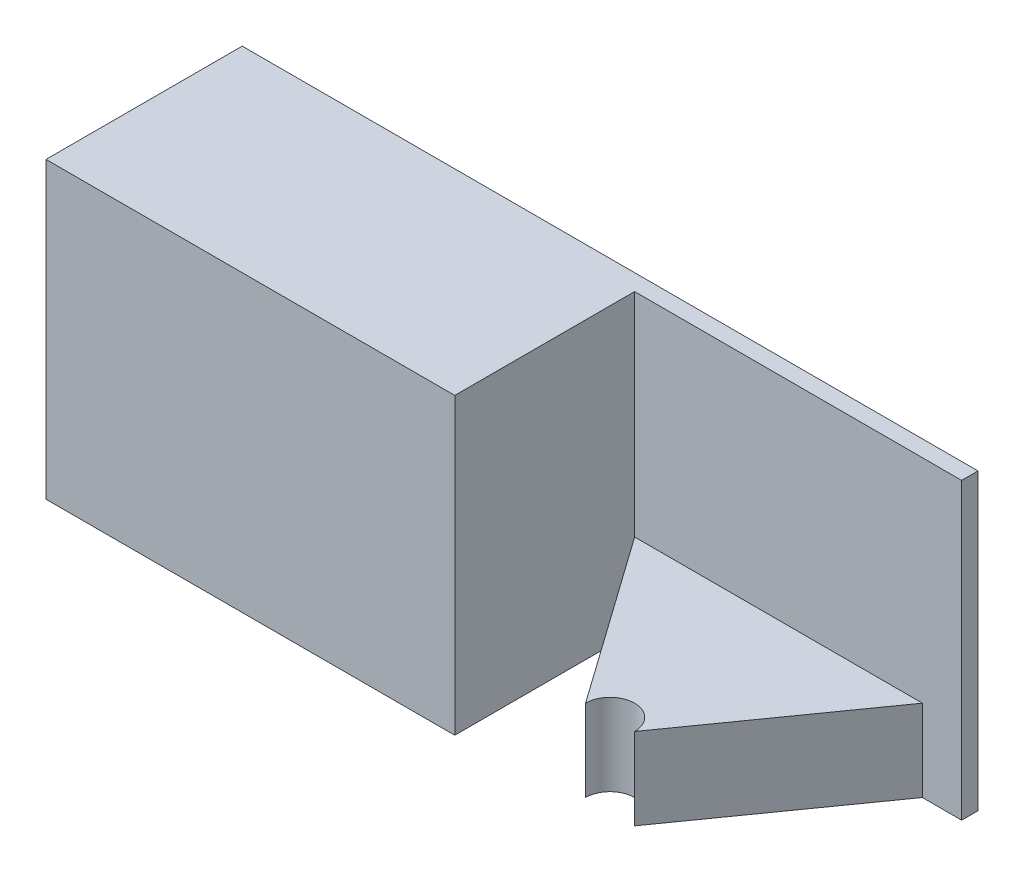
ISO-10303-21;
HEADER;
FILE_DESCRIPTION(('STEP AP214'),'2;1');
FILE_NAME('part.step','',(''),(''),'','','');
FILE_SCHEMA(('AUTOMOTIVE_DESIGN { 1 0 10303 214 1 1 1 1 }'));
ENDSEC;
DATA;
#1=APPLICATION_CONTEXT('core data for automotive mechanical design processes');
#2=APPLICATION_PROTOCOL_DEFINITION('international standard','automotive_design',2000,#1);
#3=PRODUCT_CONTEXT('',#1,'mechanical');
#4=PRODUCT('Part','Part','',(#3));
#5=PRODUCT_RELATED_PRODUCT_CATEGORY('part','',(#4));
#6=PRODUCT_DEFINITION_FORMATION('','',#4);
#7=PRODUCT_DEFINITION_CONTEXT('part definition',#1,'design');
#8=PRODUCT_DEFINITION('design','',#6,#7);
#9=PRODUCT_DEFINITION_SHAPE('','',#8);
#10=(LENGTH_UNIT() NAMED_UNIT(*) SI_UNIT(.MILLI.,.METRE.));
#11=(NAMED_UNIT(*) PLANE_ANGLE_UNIT() SI_UNIT($,.RADIAN.));
#12=(NAMED_UNIT(*) SI_UNIT($,.STERADIAN.) SOLID_ANGLE_UNIT());
#13=UNCERTAINTY_MEASURE_WITH_UNIT(LENGTH_MEASURE(1.E-05),#10,'distance_accuracy_value','');
#14=(GEOMETRIC_REPRESENTATION_CONTEXT(3) GLOBAL_UNCERTAINTY_ASSIGNED_CONTEXT((#13)) GLOBAL_UNIT_ASSIGNED_CONTEXT((#10,
#11,#12)) REPRESENTATION_CONTEXT('',''));
#15=CARTESIAN_POINT('',(0.,0.,0.));
#16=DIRECTION('',(0.,0.,1.));
#17=DIRECTION('',(1.,0.,0.));
#18=AXIS2_PLACEMENT_3D('',#15,#16,#17);
#19=CARTESIAN_POINT('',(125.,180.,60.));
#20=DIRECTION('',(-1.,0.,0.));
#21=DIRECTION('',(0.,0.,1.));
#22=AXIS2_PLACEMENT_3D('',#19,#20,#21);
#23=PLANE('',#22);
#24=DIRECTION('',(0.,-1.,0.));
#25=VECTOR('',#24,1.);
#26=CARTESIAN_POINT('',(125.,180.,-50.));
#27=LINE('',#26,#25);
#28=CARTESIAN_POINT('',(125.,180.,-50.));
#29=VERTEX_POINT('',#28);
#30=CARTESIAN_POINT('',(125.,50.,-50.));
#31=VERTEX_POINT('',#30);
#32=EDGE_CURVE('E188',#29,#31,#27,.T.);
#33=ORIENTED_EDGE('',*,*,#32,.F.);
#34=DIRECTION('',(0.,0.,-1.));
#35=VECTOR('',#34,1.);
#36=CARTESIAN_POINT('',(125.,180.,60.));
#37=LINE('',#36,#35);
#38=CARTESIAN_POINT('',(125.,180.,60.));
#39=VERTEX_POINT('',#38);
#40=EDGE_CURVE('E193',#39,#29,#37,.T.);
#41=ORIENTED_EDGE('',*,*,#40,.F.);
#42=DIRECTION('',(0.,-1.,0.));
#43=VECTOR('',#42,1.);
#44=CARTESIAN_POINT('',(125.,180.,60.));
#45=LINE('',#44,#43);
#46=CARTESIAN_POINT('',(125.,0.,60.));
#47=VERTEX_POINT('',#46);
#48=EDGE_CURVE('E199',#39,#47,#45,.T.);
#49=ORIENTED_EDGE('',*,*,#48,.T.);
#50=DIRECTION('',(0.,0.,-1.));
#51=VECTOR('',#50,1.);
#52=CARTESIAN_POINT('',(125.,0.,60.));
#53=LINE('',#52,#51);
#54=CARTESIAN_POINT('',(125.,0.,-50.));
#55=VERTEX_POINT('',#54);
#56=EDGE_CURVE('E192',#47,#55,#53,.T.);
#57=ORIENTED_EDGE('',*,*,#56,.T.);
#58=DIRECTION('',(0.,-1.,0.));
#59=VECTOR('',#58,1.);
#60=CARTESIAN_POINT('',(125.,50.,-50.));
#61=LINE('',#60,#59);
#62=EDGE_CURVE('E144',#31,#55,#61,.T.);
#63=ORIENTED_EDGE('',*,*,#62,.F.);
#64=EDGE_LOOP('',(#33,#41,#49,#57,#63));
#65=FACE_BOUND('',#64,.T.);
#66=ADVANCED_FACE('F51',(#65),#23,.F.);
#67=CARTESIAN_POINT('',(-125.,180.,-60.));
#68=DIRECTION('',(0.,0.,1.));
#69=DIRECTION('',(1.,0.,0.));
#70=AXIS2_PLACEMENT_3D('',#67,#68,#69);
#71=PLANE('',#70);
#72=DIRECTION('',(-1.,0.,0.));
#73=VECTOR('',#72,1.);
#74=CARTESIAN_POINT('',(-125.,0.,-60.));
#75=LINE('',#74,#73);
#76=CARTESIAN_POINT('',(325.,0.,-60.));
#77=VERTEX_POINT('',#76);
#78=CARTESIAN_POINT('',(-125.,0.,-60.));
#79=VERTEX_POINT('',#78);
#80=EDGE_CURVE('E202',#77,#79,#75,.T.);
#81=ORIENTED_EDGE('',*,*,#80,.T.);
#82=DIRECTION('',(0.,-1.,0.));
#83=VECTOR('',#82,1.);
#84=CARTESIAN_POINT('',(-125.,180.,-60.));
#85=LINE('',#84,#83);
#86=CARTESIAN_POINT('',(-125.,180.,-60.));
#87=VERTEX_POINT('',#86);
#88=EDGE_CURVE('E11',#87,#79,#85,.T.);
#89=ORIENTED_EDGE('',*,*,#88,.F.);
#90=DIRECTION('',(-1.,0.,0.));
#91=VECTOR('',#90,1.);
#92=CARTESIAN_POINT('',(-125.,180.,-60.));
#93=LINE('',#92,#91);
#94=CARTESIAN_POINT('',(325.,180.,-60.));
#95=VERTEX_POINT('',#94);
#96=EDGE_CURVE('E91',#95,#87,#93,.T.);
#97=ORIENTED_EDGE('',*,*,#96,.F.);
#98=DIRECTION('',(0.,-1.,0.));
#99=VECTOR('',#98,1.);
#100=CARTESIAN_POINT('',(325.,180.,-60.));
#101=LINE('',#100,#99);
#102=EDGE_CURVE('E169',#95,#77,#101,.T.);
#103=ORIENTED_EDGE('',*,*,#102,.T.);
#104=EDGE_LOOP('',(#81,#89,#97,#103));
#105=FACE_BOUND('',#104,.T.);
#106=ADVANCED_FACE('F224',(#105),#71,.F.);
#107=CARTESIAN_POINT('',(-125.,180.,60.));
#108=DIRECTION('',(1.,0.,0.));
#109=DIRECTION('',(0.,0.,-1.));
#110=AXIS2_PLACEMENT_3D('',#107,#108,#109);
#111=PLANE('',#110);
#112=DIRECTION('',(0.,0.,1.));
#113=VECTOR('',#112,1.);
#114=CARTESIAN_POINT('',(-125.,0.,60.));
#115=LINE('',#114,#113);
#116=CARTESIAN_POINT('',(-125.,0.,60.));
#117=VERTEX_POINT('',#116);
#118=EDGE_CURVE('E81',#79,#117,#115,.T.);
#119=ORIENTED_EDGE('',*,*,#118,.T.);
#120=DIRECTION('',(0.,-1.,0.));
#121=VECTOR('',#120,1.);
#122=CARTESIAN_POINT('',(-125.,180.,60.));
#123=LINE('',#122,#121);
#124=CARTESIAN_POINT('',(-125.,180.,60.));
#125=VERTEX_POINT('',#124);
#126=EDGE_CURVE('E59',#125,#117,#123,.T.);
#127=ORIENTED_EDGE('',*,*,#126,.F.);
#128=DIRECTION('',(0.,0.,1.));
#129=VECTOR('',#128,1.);
#130=CARTESIAN_POINT('',(-125.,180.,60.));
#131=LINE('',#130,#129);
#132=EDGE_CURVE('E196',#87,#125,#131,.T.);
#133=ORIENTED_EDGE('',*,*,#132,.F.);
#134=ORIENTED_EDGE('',*,*,#88,.T.);
#135=EDGE_LOOP('',(#119,#127,#133,#134));
#136=FACE_BOUND('',#135,.T.);
#137=ADVANCED_FACE('F225',(#136),#111,.F.);
#138=CARTESIAN_POINT('',(-125.,180.,60.));
#139=DIRECTION('',(0.,0.,-1.));
#140=DIRECTION('',(-1.,0.,0.));
#141=AXIS2_PLACEMENT_3D('',#138,#139,#140);
#142=PLANE('',#141);
#143=DIRECTION('',(1.,0.,0.));
#144=VECTOR('',#143,1.);
#145=CARTESIAN_POINT('',(-125.,0.,60.));
#146=LINE('',#145,#144);
#147=EDGE_CURVE('E86',#117,#47,#146,.T.);
#148=ORIENTED_EDGE('',*,*,#147,.T.);
#149=ORIENTED_EDGE('',*,*,#48,.F.);
#150=DIRECTION('',(1.,0.,0.));
#151=VECTOR('',#150,1.);
#152=CARTESIAN_POINT('',(-125.,180.,60.));
#153=LINE('',#152,#151);
#154=EDGE_CURVE('E67',#125,#39,#153,.T.);
#155=ORIENTED_EDGE('',*,*,#154,.F.);
#156=ORIENTED_EDGE('',*,*,#126,.T.);
#157=EDGE_LOOP('',(#148,#149,#155,#156));
#158=FACE_BOUND('',#157,.T.);
#159=ADVANCED_FACE('F206',(#158),#142,.F.);
#160=CARTESIAN_POINT('',(0.,180.,0.));
#161=DIRECTION('',(0.,-1.,0.));
#162=DIRECTION('',(0.,0.,-1.));
#163=AXIS2_PLACEMENT_3D('',#160,#161,#162);
#164=PLANE('',#163);
#165=ORIENTED_EDGE('',*,*,#132,.T.);
#166=ORIENTED_EDGE('',*,*,#154,.T.);
#167=ORIENTED_EDGE('',*,*,#40,.T.);
#168=DIRECTION('',(1.,0.,0.));
#169=VECTOR('',#168,1.);
#170=CARTESIAN_POINT('',(-125.,180.,-50.));
#171=LINE('',#170,#169);
#172=CARTESIAN_POINT('',(325.,180.,-50.));
#173=VERTEX_POINT('',#172);
#174=EDGE_CURVE('E177',#29,#173,#171,.T.);
#175=ORIENTED_EDGE('',*,*,#174,.T.);
#176=DIRECTION('',(0.,0.,-1.));
#177=VECTOR('',#176,1.);
#178=CARTESIAN_POINT('',(325.,180.,-50.));
#179=LINE('',#178,#177);
#180=EDGE_CURVE('E182',#173,#95,#179,.T.);
#181=ORIENTED_EDGE('',*,*,#180,.T.);
#182=ORIENTED_EDGE('',*,*,#96,.T.);
#183=EDGE_LOOP('',(#165,#166,#167,#175,#181,#182));
#184=FACE_BOUND('',#183,.T.);
#185=ADVANCED_FACE('F214',(#184),#164,.F.);
#186=CARTESIAN_POINT('',(0.,0.,0.));
#187=DIRECTION('',(0.,-1.,0.));
#188=DIRECTION('',(0.,0.,-1.));
#189=AXIS2_PLACEMENT_3D('',#186,#187,#188);
#190=PLANE('',#189);
#191=ORIENTED_EDGE('',*,*,#80,.F.);
#192=DIRECTION('',(0.,0.,-1.));
#193=VECTOR('',#192,1.);
#194=CARTESIAN_POINT('',(325.,0.,-50.));
#195=LINE('',#194,#193);
#196=CARTESIAN_POINT('',(325.,0.,-50.));
#197=VERTEX_POINT('',#196);
#198=EDGE_CURVE('E185',#197,#77,#195,.T.);
#199=ORIENTED_EDGE('',*,*,#198,.F.);
#200=DIRECTION('',(-1.,0.,0.));
#201=VECTOR('',#200,1.);
#202=CARTESIAN_POINT('',(325.,0.,-50.));
#203=LINE('',#202,#201);
#204=CARTESIAN_POINT('',(300.98,0.,-50.));
#205=VERTEX_POINT('',#204);
#206=EDGE_CURVE('E174',#197,#205,#203,.T.);
#207=ORIENTED_EDGE('',*,*,#206,.T.);
#208=DIRECTION('',(-0.578184365295858,0.,0.815906146396402));
#209=VECTOR('',#208,1.);
#210=CARTESIAN_POINT('',(227.99,0.,53.));
#211=LINE('',#210,#209);
#212=CARTESIAN_POINT('',(227.99,0.,53.));
#213=VERTEX_POINT('',#212);
#214=EDGE_CURVE('E158',#205,#213,#211,.T.);
#215=ORIENTED_EDGE('',*,*,#214,.T.);
#216=CARTESIAN_POINT('',(212.99,0.,53.));
#217=DIRECTION('',(0.,1.,0.));
#218=DIRECTION('',(0.,0.,-1.));
#219=AXIS2_PLACEMENT_3D('',#216,#217,#218);
#220=CIRCLE('',#219,15.);
#221=CARTESIAN_POINT('',(197.99,0.,53.));
#222=VERTEX_POINT('',#221);
#223=EDGE_CURVE('E165',#213,#222,#220,.T.);
#224=ORIENTED_EDGE('',*,*,#223,.T.);
#225=DIRECTION('',(-0.578184365295858,0.,-0.815906146396402));
#226=VECTOR('',#225,1.);
#227=CARTESIAN_POINT('',(197.99,0.,53.));
#228=LINE('',#227,#226);
#229=EDGE_CURVE('E139',#222,#55,#228,.T.);
#230=ORIENTED_EDGE('',*,*,#229,.T.);
#231=ORIENTED_EDGE('',*,*,#56,.F.);
#232=ORIENTED_EDGE('',*,*,#147,.F.);
#233=ORIENTED_EDGE('',*,*,#118,.F.);
#234=EDGE_LOOP('',(#191,#199,#207,#215,#224,#230,#231,#232,#233));
#235=FACE_BOUND('',#234,.T.);
#236=ADVANCED_FACE('F210',(#235),#190,.T.);
#237=CARTESIAN_POINT('',(0.,0.,-50.));
#238=DIRECTION('',(0.,0.,-1.));
#239=DIRECTION('',(-1.,0.,0.));
#240=AXIS2_PLACEMENT_3D('',#237,#238,#239);
#241=PLANE('',#240);
#242=DIRECTION('',(1.,0.,0.));
#243=VECTOR('',#242,1.);
#244=CARTESIAN_POINT('',(125.,50.,-50.));
#245=LINE('',#244,#243);
#246=CARTESIAN_POINT('',(300.98,50.,-50.));
#247=VERTEX_POINT('',#246);
#248=EDGE_CURVE('E154',#31,#247,#245,.T.);
#249=ORIENTED_EDGE('',*,*,#248,.T.);
#250=DIRECTION('',(0.,-1.,0.));
#251=VECTOR('',#250,1.);
#252=CARTESIAN_POINT('',(300.98,50.,-50.));
#253=LINE('',#252,#251);
#254=EDGE_CURVE('E170',#247,#205,#253,.T.);
#255=ORIENTED_EDGE('',*,*,#254,.T.);
#256=ORIENTED_EDGE('',*,*,#206,.F.);
#257=DIRECTION('',(0.,-1.,0.));
#258=VECTOR('',#257,1.);
#259=CARTESIAN_POINT('',(325.,180.,-50.));
#260=LINE('',#259,#258);
#261=EDGE_CURVE('E179',#173,#197,#260,.T.);
#262=ORIENTED_EDGE('',*,*,#261,.F.);
#263=ORIENTED_EDGE('',*,*,#174,.F.);
#264=ORIENTED_EDGE('',*,*,#32,.T.);
#265=EDGE_LOOP('',(#249,#255,#256,#262,#263,#264));
#266=FACE_BOUND('',#265,.T.);
#267=ADVANCED_FACE('F222',(#266),#241,.F.);
#268=CARTESIAN_POINT('',(325.,180.,-50.));
#269=DIRECTION('',(1.,0.,0.));
#270=DIRECTION('',(0.,0.,-1.));
#271=AXIS2_PLACEMENT_3D('',#268,#269,#270);
#272=PLANE('',#271);
#273=ORIENTED_EDGE('',*,*,#102,.F.);
#274=ORIENTED_EDGE('',*,*,#180,.F.);
#275=ORIENTED_EDGE('',*,*,#261,.T.);
#276=ORIENTED_EDGE('',*,*,#198,.T.);
#277=EDGE_LOOP('',(#273,#274,#275,#276));
#278=FACE_BOUND('',#277,.T.);
#279=ADVANCED_FACE('F220',(#278),#272,.T.);
#280=CARTESIAN_POINT('',(212.99,50.,53.));
#281=DIRECTION('',(0.,-1.,0.));
#282=DIRECTION('',(0.,0.,-1.));
#283=AXIS2_PLACEMENT_3D('',#280,#281,#282);
#284=CYLINDRICAL_SURFACE('',#283,15.);
#285=ORIENTED_EDGE('',*,*,#223,.F.);
#286=DIRECTION('',(0.,-1.,0.));
#287=VECTOR('',#286,1.);
#288=CARTESIAN_POINT('',(227.99,50.,53.));
#289=LINE('',#288,#287);
#290=CARTESIAN_POINT('',(227.99,50.,53.));
#291=VERTEX_POINT('',#290);
#292=EDGE_CURVE('E157',#291,#213,#289,.T.);
#293=ORIENTED_EDGE('',*,*,#292,.F.);
#294=CARTESIAN_POINT('',(212.99,50.,53.));
#295=DIRECTION('',(0.,1.,0.));
#296=DIRECTION('',(0.,0.,-1.));
#297=AXIS2_PLACEMENT_3D('',#294,#295,#296);
#298=CIRCLE('',#297,15.);
#299=CARTESIAN_POINT('',(197.99,50.,53.));
#300=VERTEX_POINT('',#299);
#301=EDGE_CURVE('E151',#291,#300,#298,.T.);
#302=ORIENTED_EDGE('',*,*,#301,.T.);
#303=DIRECTION('',(0.,-1.,0.));
#304=VECTOR('',#303,1.);
#305=CARTESIAN_POINT('',(197.99,50.,53.));
#306=LINE('',#305,#304);
#307=EDGE_CURVE('E133',#300,#222,#306,.T.);
#308=ORIENTED_EDGE('',*,*,#307,.T.);
#309=EDGE_LOOP('',(#285,#293,#302,#308));
#310=FACE_BOUND('',#309,.T.);
#311=ADVANCED_FACE('F156',(#310),#284,.F.);
#312=CARTESIAN_POINT('',(227.99,50.,53.));
#313=DIRECTION('',(0.815906146396401,0.,0.578184365295858));
#314=DIRECTION('',(0.578184365295858,0.,-0.815906146396402));
#315=AXIS2_PLACEMENT_3D('',#312,#313,#314);
#316=PLANE('',#315);
#317=ORIENTED_EDGE('',*,*,#214,.F.);
#318=ORIENTED_EDGE('',*,*,#254,.F.);
#319=DIRECTION('',(-0.578184365295858,0.,0.815906146396402));
#320=VECTOR('',#319,1.);
#321=CARTESIAN_POINT('',(227.99,50.,53.));
#322=LINE('',#321,#320);
#323=EDGE_CURVE('E145',#247,#291,#322,.T.);
#324=ORIENTED_EDGE('',*,*,#323,.T.);
#325=ORIENTED_EDGE('',*,*,#292,.T.);
#326=EDGE_LOOP('',(#317,#318,#324,#325));
#327=FACE_BOUND('',#326,.T.);
#328=ADVANCED_FACE('F261',(#327),#316,.T.);
#329=CARTESIAN_POINT('',(197.99,50.,53.));
#330=DIRECTION('',(-0.815906146396402,0.,0.578184365295858));
#331=DIRECTION('',(0.578184365295858,0.,0.815906146396401));
#332=AXIS2_PLACEMENT_3D('',#329,#330,#331);
#333=PLANE('',#332);
#334=ORIENTED_EDGE('',*,*,#229,.F.);
#335=ORIENTED_EDGE('',*,*,#307,.F.);
#336=DIRECTION('',(-0.578184365295858,0.,-0.815906146396402));
#337=VECTOR('',#336,1.);
#338=CARTESIAN_POINT('',(197.99,50.,53.));
#339=LINE('',#338,#337);
#340=EDGE_CURVE('E137',#300,#31,#339,.T.);
#341=ORIENTED_EDGE('',*,*,#340,.T.);
#342=ORIENTED_EDGE('',*,*,#62,.T.);
#343=EDGE_LOOP('',(#334,#335,#341,#342));
#344=FACE_BOUND('',#343,.T.);
#345=ADVANCED_FACE('F135',(#344),#333,.T.);
#346=CARTESIAN_POINT('',(212.99,50.,53.));
#347=DIRECTION('',(0.,-1.,0.));
#348=DIRECTION('',(0.,0.,-1.));
#349=AXIS2_PLACEMENT_3D('',#346,#347,#348);
#350=PLANE('',#349);
#351=ORIENTED_EDGE('',*,*,#301,.F.);
#352=ORIENTED_EDGE('',*,*,#323,.F.);
#353=ORIENTED_EDGE('',*,*,#248,.F.);
#354=ORIENTED_EDGE('',*,*,#340,.F.);
#355=EDGE_LOOP('',(#351,#352,#353,#354));
#356=FACE_BOUND('',#355,.T.);
#357=ADVANCED_FACE('F149',(#356),#350,.F.);
#358=CLOSED_SHELL('',(#66,#106,#137,#159,#185,#236,#267,#279,#311,#328,#345,#357));
#359=MANIFOLD_SOLID_BREP('B2',#358);
#360=ADVANCED_BREP_SHAPE_REPRESENTATION('',(#18,#359),#14);
#361=SHAPE_DEFINITION_REPRESENTATION(#9,#360);
ENDSEC;
END-ISO-10303-21;
